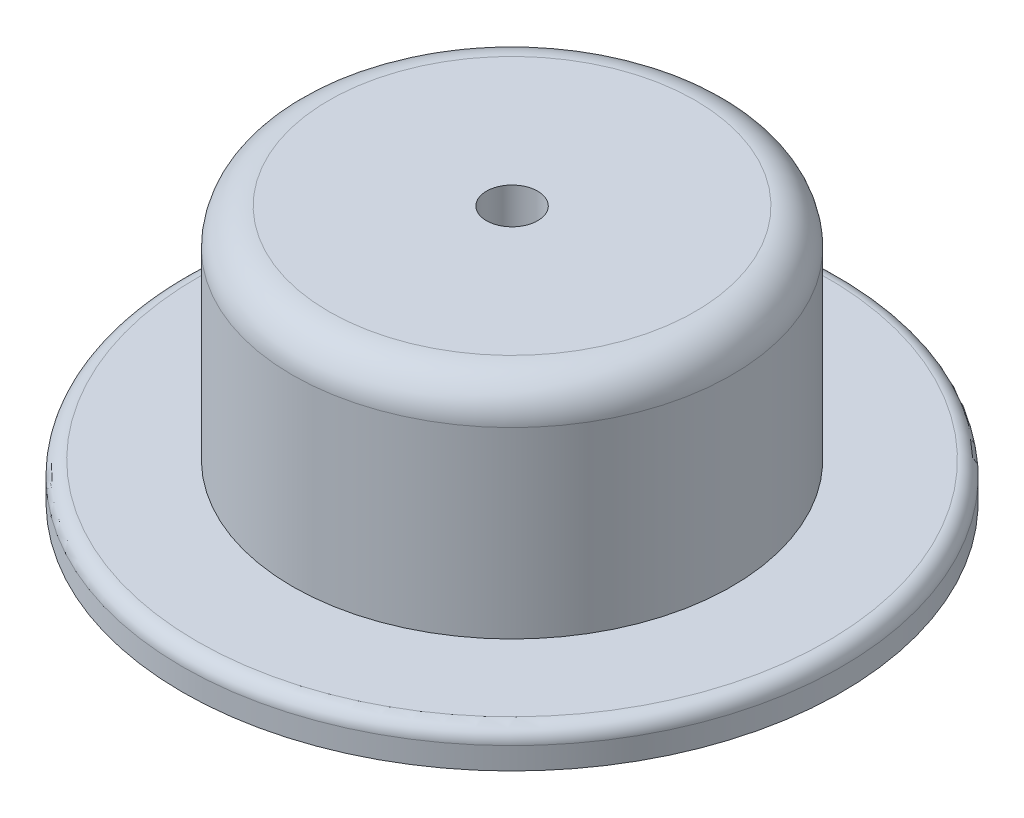
ISO-10303-21;
HEADER;
FILE_DESCRIPTION(('STEP AP214'),'2;1');
FILE_NAME('part.step','',(''),(''),'','','');
FILE_SCHEMA(('AUTOMOTIVE_DESIGN { 1 0 10303 214 1 1 1 1 }'));
ENDSEC;
DATA;
#1=APPLICATION_CONTEXT('core data for automotive mechanical design processes');
#2=APPLICATION_PROTOCOL_DEFINITION('international standard','automotive_design',2000,#1);
#3=PRODUCT_CONTEXT('',#1,'mechanical');
#4=PRODUCT('Part','Part','',(#3));
#5=PRODUCT_RELATED_PRODUCT_CATEGORY('part','',(#4));
#6=PRODUCT_DEFINITION_FORMATION('','',#4);
#7=PRODUCT_DEFINITION_CONTEXT('part definition',#1,'design');
#8=PRODUCT_DEFINITION('design','',#6,#7);
#9=PRODUCT_DEFINITION_SHAPE('','',#8);
#10=(LENGTH_UNIT() NAMED_UNIT(*) SI_UNIT(.MILLI.,.METRE.));
#11=(NAMED_UNIT(*) PLANE_ANGLE_UNIT() SI_UNIT($,.RADIAN.));
#12=(NAMED_UNIT(*) SI_UNIT($,.STERADIAN.) SOLID_ANGLE_UNIT());
#13=UNCERTAINTY_MEASURE_WITH_UNIT(LENGTH_MEASURE(1.E-05),#10,'distance_accuracy_value','');
#14=(GEOMETRIC_REPRESENTATION_CONTEXT(3) GLOBAL_UNCERTAINTY_ASSIGNED_CONTEXT((#13)) GLOBAL_UNIT_ASSIGNED_CONTEXT((#10,
#11,#12)) REPRESENTATION_CONTEXT('',''));
#15=CARTESIAN_POINT('',(0.,0.,0.));
#16=DIRECTION('',(0.,0.,1.));
#17=DIRECTION('',(1.,0.,0.));
#18=AXIS2_PLACEMENT_3D('',#15,#16,#17);
#19=CARTESIAN_POINT('',(0.,0.5,0.));
#20=DIRECTION('',(0.,1.,0.));
#21=DIRECTION('',(0.,0.,1.));
#22=AXIS2_PLACEMENT_3D('',#19,#20,#21);
#23=PLANE('',#22);
#24=CARTESIAN_POINT('',(0.,0.5,0.));
#25=DIRECTION('',(0.,1.,0.));
#26=DIRECTION('',(0.,0.,1.));
#27=AXIS2_PLACEMENT_3D('',#24,#25,#26);
#28=CIRCLE('',#27,4.3);
#29=CARTESIAN_POINT('',(0.,0.5,4.3));
#30=VERTEX_POINT('',#29);
#31=EDGE_CURVE('E49',#30,#30,#28,.T.);
#32=ORIENTED_EDGE('',*,*,#31,.T.);
#33=EDGE_LOOP('',(#32));
#34=FACE_BOUND('',#33,.T.);
#35=CARTESIAN_POINT('',(0.,0.5,0.));
#36=DIRECTION('',(0.,1.,0.));
#37=DIRECTION('',(0.,0.,1.));
#38=AXIS2_PLACEMENT_3D('',#35,#36,#37);
#39=CIRCLE('',#38,3.);
#40=CARTESIAN_POINT('',(0.,0.5,3.));
#41=VERTEX_POINT('',#40);
#42=EDGE_CURVE('E65',#41,#41,#39,.T.);
#43=ORIENTED_EDGE('',*,*,#42,.F.);
#44=EDGE_LOOP('',(#43));
#45=FACE_BOUND('',#44,.T.);
#46=ADVANCED_FACE('F41',(#34,#45),#23,.T.);
#47=CARTESIAN_POINT('',(0.,0.,0.));
#48=DIRECTION('',(0.,1.,0.));
#49=DIRECTION('',(0.,0.,1.));
#50=AXIS2_PLACEMENT_3D('',#47,#48,#49);
#51=PLANE('',#50);
#52=CARTESIAN_POINT('',(0.,0.,0.));
#53=DIRECTION('',(0.,1.,0.));
#54=DIRECTION('',(0.,0.,1.));
#55=AXIS2_PLACEMENT_3D('',#52,#53,#54);
#56=CIRCLE('',#55,4.5);
#57=CARTESIAN_POINT('',(0.,0.,4.5));
#58=VERTEX_POINT('',#57);
#59=EDGE_CURVE('E66',#58,#58,#56,.T.);
#60=ORIENTED_EDGE('',*,*,#59,.F.);
#61=EDGE_LOOP('',(#60));
#62=FACE_BOUND('',#61,.T.);
#63=CARTESIAN_POINT('',(0.,0.,0.));
#64=DIRECTION('',(0.,1.,0.));
#65=DIRECTION('',(0.,0.,1.));
#66=AXIS2_PLACEMENT_3D('',#63,#64,#65);
#67=CIRCLE('',#66,0.375);
#68=CARTESIAN_POINT('',(0.,0.,0.375));
#69=VERTEX_POINT('',#68);
#70=EDGE_CURVE('E70',#69,#69,#67,.T.);
#71=ORIENTED_EDGE('',*,*,#70,.T.);
#72=EDGE_LOOP('',(#71));
#73=FACE_BOUND('',#72,.T.);
#74=ADVANCED_FACE('F111',(#62,#73),#51,.F.);
#75=CARTESIAN_POINT('',(0.,0.5,0.));
#76=DIRECTION('',(0.,-1.,0.));
#77=DIRECTION('',(0.,0.,-1.));
#78=AXIS2_PLACEMENT_3D('',#75,#76,#77);
#79=CYLINDRICAL_SURFACE('',#78,4.5);
#80=CARTESIAN_POINT('',(0.,0.3,0.));
#81=DIRECTION('',(0.,1.,0.));
#82=DIRECTION('',(0.,0.,1.));
#83=AXIS2_PLACEMENT_3D('',#80,#81,#82);
#84=CIRCLE('',#83,4.5);
#85=CARTESIAN_POINT('',(0.,0.3,4.5));
#86=VERTEX_POINT('',#85);
#87=EDGE_CURVE('E10',#86,#86,#84,.F.);
#88=ORIENTED_EDGE('',*,*,#87,.T.);
#89=EDGE_LOOP('',(#88));
#90=FACE_BOUND('',#89,.T.);
#91=ORIENTED_EDGE('',*,*,#59,.T.);
#92=EDGE_LOOP('',(#91));
#93=FACE_BOUND('',#92,.T.);
#94=ADVANCED_FACE('F106',(#90,#93),#79,.T.);
#95=CARTESIAN_POINT('',(0.,0.5,0.));
#96=DIRECTION('',(0.,-1.,0.));
#97=DIRECTION('',(0.,0.,-1.));
#98=AXIS2_PLACEMENT_3D('',#95,#96,#97);
#99=CYLINDRICAL_SURFACE('',#98,0.375);
#100=CARTESIAN_POINT('',(0.,0.5,0.));
#101=DIRECTION('',(0.,1.,0.));
#102=DIRECTION('',(0.,0.,1.));
#103=AXIS2_PLACEMENT_3D('',#100,#101,#102);
#104=CIRCLE('',#103,0.375);
#105=CARTESIAN_POINT('',(0.,0.5,0.375));
#106=VERTEX_POINT('',#105);
#107=EDGE_CURVE('E74',#106,#106,#104,.T.);
#108=ORIENTED_EDGE('',*,*,#107,.T.);
#109=EDGE_LOOP('',(#108));
#110=FACE_BOUND('',#109,.T.);
#111=ORIENTED_EDGE('',*,*,#70,.F.);
#112=EDGE_LOOP('',(#111));
#113=FACE_BOUND('',#112,.T.);
#114=ADVANCED_FACE('F96',(#110,#113),#99,.F.);
#115=CARTESIAN_POINT('',(0.,3.5,0.));
#116=DIRECTION('',(0.,1.,0.));
#117=DIRECTION('',(0.,0.,1.));
#118=AXIS2_PLACEMENT_3D('',#115,#116,#117);
#119=PLANE('',#118);
#120=CARTESIAN_POINT('',(0.,3.5,0.));
#121=DIRECTION('',(0.,1.,0.));
#122=DIRECTION('',(0.,0.,1.));
#123=AXIS2_PLACEMENT_3D('',#120,#121,#122);
#124=CIRCLE('',#123,2.5);
#125=CARTESIAN_POINT('',(0.,3.5,2.5));
#126=VERTEX_POINT('',#125);
#127=EDGE_CURVE('E59',#126,#126,#124,.T.);
#128=ORIENTED_EDGE('',*,*,#127,.T.);
#129=EDGE_LOOP('',(#128));
#130=FACE_BOUND('',#129,.T.);
#131=CARTESIAN_POINT('',(0.,3.5,0.));
#132=DIRECTION('',(0.,1.,0.));
#133=DIRECTION('',(0.,0.,1.));
#134=AXIS2_PLACEMENT_3D('',#131,#132,#133);
#135=CIRCLE('',#134,0.35);
#136=CARTESIAN_POINT('',(0.,3.5,0.35));
#137=VERTEX_POINT('',#136);
#138=EDGE_CURVE('E78',#137,#137,#135,.T.);
#139=ORIENTED_EDGE('',*,*,#138,.F.);
#140=EDGE_LOOP('',(#139));
#141=FACE_BOUND('',#140,.T.);
#142=ADVANCED_FACE('F93',(#130,#141),#119,.T.);
#143=CARTESIAN_POINT('',(0.,0.5,0.));
#144=DIRECTION('',(0.,1.,0.));
#145=DIRECTION('',(0.,0.,1.));
#146=AXIS2_PLACEMENT_3D('',#143,#144,#145);
#147=PLANE('',#146);
#148=ORIENTED_EDGE('',*,*,#107,.F.);
#149=EDGE_LOOP('',(#148));
#150=FACE_BOUND('',#149,.T.);
#151=CARTESIAN_POINT('',(0.,0.5,0.));
#152=DIRECTION('',(0.,1.,0.));
#153=DIRECTION('',(0.,0.,1.));
#154=AXIS2_PLACEMENT_3D('',#151,#152,#153);
#155=CIRCLE('',#154,0.35);
#156=CARTESIAN_POINT('',(0.,0.5,0.35));
#157=VERTEX_POINT('',#156);
#158=EDGE_CURVE('E82',#157,#157,#155,.T.);
#159=ORIENTED_EDGE('',*,*,#158,.T.);
#160=EDGE_LOOP('',(#159));
#161=FACE_BOUND('',#160,.T.);
#162=ADVANCED_FACE('F95',(#150,#161),#147,.F.);
#163=CARTESIAN_POINT('',(0.,3.5,0.));
#164=DIRECTION('',(0.,-1.,0.));
#165=DIRECTION('',(0.,0.,-1.));
#166=AXIS2_PLACEMENT_3D('',#163,#164,#165);
#167=CYLINDRICAL_SURFACE('',#166,3.);
#168=CARTESIAN_POINT('',(0.,3.,0.));
#169=DIRECTION('',(0.,1.,0.));
#170=DIRECTION('',(0.,0.,1.));
#171=AXIS2_PLACEMENT_3D('',#168,#169,#170);
#172=CIRCLE('',#171,3.);
#173=CARTESIAN_POINT('',(0.,3.,3.));
#174=VERTEX_POINT('',#173);
#175=EDGE_CURVE('E54',#174,#174,#172,.F.);
#176=ORIENTED_EDGE('',*,*,#175,.T.);
#177=EDGE_LOOP('',(#176));
#178=FACE_BOUND('',#177,.T.);
#179=ORIENTED_EDGE('',*,*,#42,.T.);
#180=EDGE_LOOP('',(#179));
#181=FACE_BOUND('',#180,.T.);
#182=ADVANCED_FACE('F103',(#178,#181),#167,.T.);
#183=CARTESIAN_POINT('',(0.,3.5,0.));
#184=DIRECTION('',(0.,-1.,0.));
#185=DIRECTION('',(0.,0.,-1.));
#186=AXIS2_PLACEMENT_3D('',#183,#184,#185);
#187=CYLINDRICAL_SURFACE('',#186,0.35);
#188=ORIENTED_EDGE('',*,*,#138,.T.);
#189=EDGE_LOOP('',(#188));
#190=FACE_BOUND('',#189,.T.);
#191=ORIENTED_EDGE('',*,*,#158,.F.);
#192=EDGE_LOOP('',(#191));
#193=FACE_BOUND('',#192,.T.);
#194=ADVANCED_FACE('F90',(#190,#193),#187,.F.);
#195=CARTESIAN_POINT('',(0.,3.,0.));
#196=DIRECTION('',(0.,1.,0.));
#197=DIRECTION('',(0.,0.,1.));
#198=AXIS2_PLACEMENT_3D('',#195,#196,#197);
#199=TOROIDAL_SURFACE('',#198,2.5,0.5);
#200=ORIENTED_EDGE('',*,*,#175,.F.);
#201=EDGE_LOOP('',(#200));
#202=FACE_BOUND('',#201,.T.);
#203=ORIENTED_EDGE('',*,*,#127,.F.);
#204=EDGE_LOOP('',(#203));
#205=FACE_BOUND('',#204,.T.);
#206=ADVANCED_FACE('F122',(#202,#205),#199,.T.);
#207=CARTESIAN_POINT('',(0.,0.3,0.));
#208=DIRECTION('',(0.,1.,0.));
#209=DIRECTION('',(0.,0.,1.));
#210=AXIS2_PLACEMENT_3D('',#207,#208,#209);
#211=TOROIDAL_SURFACE('',#210,4.3,0.2);
#212=ORIENTED_EDGE('',*,*,#87,.F.);
#213=EDGE_LOOP('',(#212));
#214=FACE_BOUND('',#213,.T.);
#215=ORIENTED_EDGE('',*,*,#31,.F.);
#216=EDGE_LOOP('',(#215));
#217=FACE_BOUND('',#216,.T.);
#218=ADVANCED_FACE('F43',(#214,#217),#211,.T.);
#219=CLOSED_SHELL('',(#46,#74,#94,#114,#142,#162,#182,#194,#206,#218));
#220=MANIFOLD_SOLID_BREP('B2',#219);
#221=ADVANCED_BREP_SHAPE_REPRESENTATION('',(#18,#220),#14);
#222=SHAPE_DEFINITION_REPRESENTATION(#9,#221);
ENDSEC;
END-ISO-10303-21;
